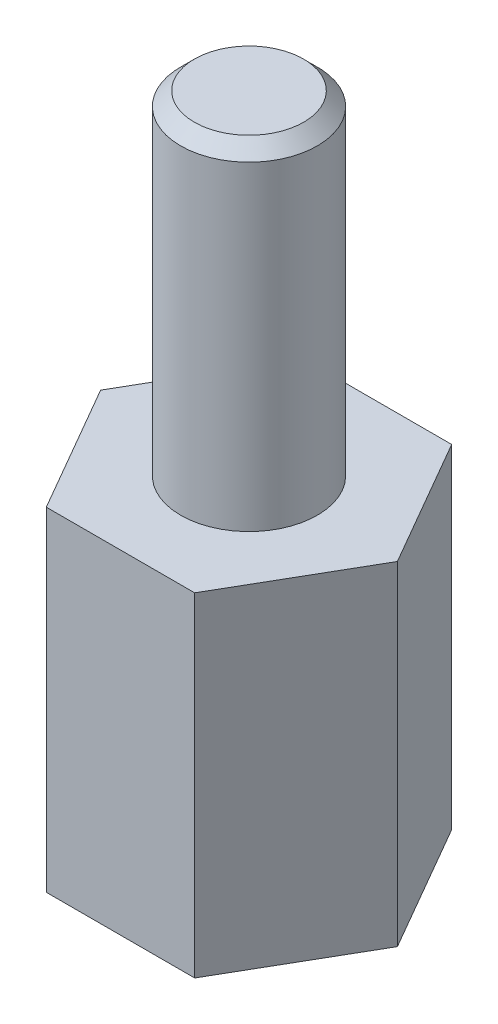
ISO-10303-21;
HEADER;
FILE_DESCRIPTION(('STEP AP214'),'2;1');
FILE_NAME('part.step','',(''),(''),'','','');
FILE_SCHEMA(('AUTOMOTIVE_DESIGN { 1 0 10303 214 1 1 1 1 }'));
ENDSEC;
DATA;
#1=APPLICATION_CONTEXT('core data for automotive mechanical design processes');
#2=APPLICATION_PROTOCOL_DEFINITION('international standard','automotive_design',2000,#1);
#3=PRODUCT_CONTEXT('',#1,'mechanical');
#4=PRODUCT('Part','Part','',(#3));
#5=PRODUCT_RELATED_PRODUCT_CATEGORY('part','',(#4));
#6=PRODUCT_DEFINITION_FORMATION('','',#4);
#7=PRODUCT_DEFINITION_CONTEXT('part definition',#1,'design');
#8=PRODUCT_DEFINITION('design','',#6,#7);
#9=PRODUCT_DEFINITION_SHAPE('','',#8);
#10=(LENGTH_UNIT() NAMED_UNIT(*) SI_UNIT(.MILLI.,.METRE.));
#11=(NAMED_UNIT(*) PLANE_ANGLE_UNIT() SI_UNIT($,.RADIAN.));
#12=(NAMED_UNIT(*) SI_UNIT($,.STERADIAN.) SOLID_ANGLE_UNIT());
#13=UNCERTAINTY_MEASURE_WITH_UNIT(LENGTH_MEASURE(1.E-05),#10,'distance_accuracy_value','');
#14=(GEOMETRIC_REPRESENTATION_CONTEXT(3) GLOBAL_UNCERTAINTY_ASSIGNED_CONTEXT((#13)) GLOBAL_UNIT_ASSIGNED_CONTEXT((#10,
#11,#12)) REPRESENTATION_CONTEXT('',''));
#15=CARTESIAN_POINT('',(0.,0.,0.));
#16=DIRECTION('',(0.,0.,1.));
#17=DIRECTION('',(1.,0.,0.));
#18=AXIS2_PLACEMENT_3D('',#15,#16,#17);
#19=CARTESIAN_POINT('',(1.35677313259562,6.1,2.35));
#20=DIRECTION('',(-0.866025403784439,0.,-0.5));
#21=DIRECTION('',(-0.5,0.,0.866025403784439));
#22=AXIS2_PLACEMENT_3D('',#19,#20,#21);
#23=PLANE('',#22);
#24=DIRECTION('',(0.5,0.,-0.866025403784439));
#25=VECTOR('',#24,1.);
#26=CARTESIAN_POINT('',(1.35677313259562,0.,2.35));
#27=LINE('',#26,#25);
#28=CARTESIAN_POINT('',(1.35677313259562,0.,2.35));
#29=VERTEX_POINT('',#28);
#30=CARTESIAN_POINT('',(2.71354626519124,0.,0.));
#31=VERTEX_POINT('',#30);
#32=EDGE_CURVE('E128',#29,#31,#27,.T.);
#33=ORIENTED_EDGE('',*,*,#32,.T.);
#34=DIRECTION('',(0.,-1.,0.));
#35=VECTOR('',#34,1.);
#36=CARTESIAN_POINT('',(2.71354626519124,6.1,0.));
#37=LINE('',#36,#35);
#38=CARTESIAN_POINT('',(2.71354626519124,6.1,0.));
#39=VERTEX_POINT('',#38);
#40=EDGE_CURVE('E146',#39,#31,#37,.T.);
#41=ORIENTED_EDGE('',*,*,#40,.F.);
#42=DIRECTION('',(0.5,0.,-0.866025403784439));
#43=VECTOR('',#42,1.);
#44=CARTESIAN_POINT('',(1.35677313259562,6.1,2.35));
#45=LINE('',#44,#43);
#46=CARTESIAN_POINT('',(1.35677313259562,6.1,2.35));
#47=VERTEX_POINT('',#46);
#48=EDGE_CURVE('E139',#47,#39,#45,.T.);
#49=ORIENTED_EDGE('',*,*,#48,.F.);
#50=DIRECTION('',(0.,-1.,0.));
#51=VECTOR('',#50,1.);
#52=CARTESIAN_POINT('',(1.35677313259562,6.1,2.35));
#53=LINE('',#52,#51);
#54=EDGE_CURVE('E124',#47,#29,#53,.T.);
#55=ORIENTED_EDGE('',*,*,#54,.T.);
#56=EDGE_LOOP('',(#33,#41,#49,#55));
#57=FACE_BOUND('',#56,.T.);
#58=ADVANCED_FACE('F41',(#57),#23,.F.);
#59=CARTESIAN_POINT('',(2.71354626519124,6.1,0.));
#60=DIRECTION('',(-0.866025403784438,0.,0.5));
#61=DIRECTION('',(0.5,0.,0.866025403784439));
#62=AXIS2_PLACEMENT_3D('',#59,#60,#61);
#63=PLANE('',#62);
#64=DIRECTION('',(-0.5,0.,-0.866025403784438));
#65=VECTOR('',#64,1.);
#66=CARTESIAN_POINT('',(2.71354626519124,0.,0.));
#67=LINE('',#66,#65);
#68=CARTESIAN_POINT('',(1.35677313259562,0.,-2.35));
#69=VERTEX_POINT('',#68);
#70=EDGE_CURVE('E131',#31,#69,#67,.T.);
#71=ORIENTED_EDGE('',*,*,#70,.T.);
#72=DIRECTION('',(0.,-1.,0.));
#73=VECTOR('',#72,1.);
#74=CARTESIAN_POINT('',(1.35677313259562,6.1,-2.35));
#75=LINE('',#74,#73);
#76=CARTESIAN_POINT('',(1.35677313259562,6.1,-2.35));
#77=VERTEX_POINT('',#76);
#78=EDGE_CURVE('E143',#77,#69,#75,.T.);
#79=ORIENTED_EDGE('',*,*,#78,.F.);
#80=DIRECTION('',(-0.5,0.,-0.866025403784438));
#81=VECTOR('',#80,1.);
#82=CARTESIAN_POINT('',(2.71354626519124,6.1,0.));
#83=LINE('',#82,#81);
#84=EDGE_CURVE('E97',#39,#77,#83,.T.);
#85=ORIENTED_EDGE('',*,*,#84,.F.);
#86=ORIENTED_EDGE('',*,*,#40,.T.);
#87=EDGE_LOOP('',(#71,#79,#85,#86));
#88=FACE_BOUND('',#87,.T.);
#89=ADVANCED_FACE('F162',(#88),#63,.F.);
#90=CARTESIAN_POINT('',(1.35677313259562,6.1,-2.35));
#91=DIRECTION('',(0.,0.,1.));
#92=DIRECTION('',(1.,0.,0.));
#93=AXIS2_PLACEMENT_3D('',#90,#91,#92);
#94=PLANE('',#93);
#95=DIRECTION('',(-1.,0.,0.));
#96=VECTOR('',#95,1.);
#97=CARTESIAN_POINT('',(1.35677313259562,0.,-2.35));
#98=LINE('',#97,#96);
#99=CARTESIAN_POINT('',(-1.35677313259562,0.,-2.35));
#100=VERTEX_POINT('',#99);
#101=EDGE_CURVE('E134',#69,#100,#98,.T.);
#102=ORIENTED_EDGE('',*,*,#101,.T.);
#103=DIRECTION('',(0.,-1.,0.));
#104=VECTOR('',#103,1.);
#105=CARTESIAN_POINT('',(-1.35677313259562,6.1,-2.35));
#106=LINE('',#105,#104);
#107=CARTESIAN_POINT('',(-1.35677313259562,6.1,-2.35));
#108=VERTEX_POINT('',#107);
#109=EDGE_CURVE('E119',#108,#100,#106,.T.);
#110=ORIENTED_EDGE('',*,*,#109,.F.);
#111=DIRECTION('',(-1.,0.,0.));
#112=VECTOR('',#111,1.);
#113=CARTESIAN_POINT('',(1.35677313259562,6.1,-2.35));
#114=LINE('',#113,#112);
#115=EDGE_CURVE('E110',#77,#108,#114,.T.);
#116=ORIENTED_EDGE('',*,*,#115,.F.);
#117=ORIENTED_EDGE('',*,*,#78,.T.);
#118=EDGE_LOOP('',(#102,#110,#116,#117));
#119=FACE_BOUND('',#118,.T.);
#120=ADVANCED_FACE('F165',(#119),#94,.F.);
#121=CARTESIAN_POINT('',(-1.35677313259562,6.1,-2.35));
#122=DIRECTION('',(0.866025403784439,0.,0.5));
#123=DIRECTION('',(0.5,0.,-0.866025403784439));
#124=AXIS2_PLACEMENT_3D('',#121,#122,#123);
#125=PLANE('',#124);
#126=DIRECTION('',(-0.5,0.,0.866025403784439));
#127=VECTOR('',#126,1.);
#128=CARTESIAN_POINT('',(-1.35677313259562,0.,-2.35));
#129=LINE('',#128,#127);
#130=CARTESIAN_POINT('',(-2.71354626519124,0.,0.));
#131=VERTEX_POINT('',#130);
#132=EDGE_CURVE('E118',#100,#131,#129,.T.);
#133=ORIENTED_EDGE('',*,*,#132,.T.);
#134=DIRECTION('',(0.,-1.,0.));
#135=VECTOR('',#134,1.);
#136=CARTESIAN_POINT('',(-2.71354626519124,6.1,0.));
#137=LINE('',#136,#135);
#138=CARTESIAN_POINT('',(-2.71354626519124,6.1,0.));
#139=VERTEX_POINT('',#138);
#140=EDGE_CURVE('E115',#139,#131,#137,.T.);
#141=ORIENTED_EDGE('',*,*,#140,.F.);
#142=DIRECTION('',(-0.5,0.,0.866025403784439));
#143=VECTOR('',#142,1.);
#144=CARTESIAN_POINT('',(-1.35677313259562,6.1,-2.35));
#145=LINE('',#144,#143);
#146=EDGE_CURVE('E104',#108,#139,#145,.T.);
#147=ORIENTED_EDGE('',*,*,#146,.F.);
#148=ORIENTED_EDGE('',*,*,#109,.T.);
#149=EDGE_LOOP('',(#133,#141,#147,#148));
#150=FACE_BOUND('',#149,.T.);
#151=ADVANCED_FACE('F116',(#150),#125,.F.);
#152=CARTESIAN_POINT('',(-2.71354626519124,6.1,0.));
#153=DIRECTION('',(0.866025403784438,0.,-0.5));
#154=DIRECTION('',(-0.5,0.,-0.866025403784439));
#155=AXIS2_PLACEMENT_3D('',#152,#153,#154);
#156=PLANE('',#155);
#157=DIRECTION('',(0.5,0.,0.866025403784438));
#158=VECTOR('',#157,1.);
#159=CARTESIAN_POINT('',(-2.71354626519124,0.,0.));
#160=LINE('',#159,#158);
#161=CARTESIAN_POINT('',(-1.35677313259562,0.,2.35));
#162=VERTEX_POINT('',#161);
#163=EDGE_CURVE('E82',#131,#162,#160,.T.);
#164=ORIENTED_EDGE('',*,*,#163,.T.);
#165=DIRECTION('',(0.,-1.,0.));
#166=VECTOR('',#165,1.);
#167=CARTESIAN_POINT('',(-1.35677313259562,6.1,2.35));
#168=LINE('',#167,#166);
#169=CARTESIAN_POINT('',(-1.35677313259562,6.1,2.35));
#170=VERTEX_POINT('',#169);
#171=EDGE_CURVE('E120',#170,#162,#168,.T.);
#172=ORIENTED_EDGE('',*,*,#171,.F.);
#173=DIRECTION('',(0.5,0.,0.866025403784438));
#174=VECTOR('',#173,1.);
#175=CARTESIAN_POINT('',(-2.71354626519124,6.1,0.));
#176=LINE('',#175,#174);
#177=EDGE_CURVE('E108',#139,#170,#176,.T.);
#178=ORIENTED_EDGE('',*,*,#177,.F.);
#179=ORIENTED_EDGE('',*,*,#140,.T.);
#180=EDGE_LOOP('',(#164,#172,#178,#179));
#181=FACE_BOUND('',#180,.T.);
#182=ADVANCED_FACE('F122',(#181),#156,.F.);
#183=CARTESIAN_POINT('',(-1.35677313259562,6.1,2.35));
#184=DIRECTION('',(0.,0.,-1.));
#185=DIRECTION('',(-1.,0.,0.));
#186=AXIS2_PLACEMENT_3D('',#183,#184,#185);
#187=PLANE('',#186);
#188=DIRECTION('',(1.,0.,0.));
#189=VECTOR('',#188,1.);
#190=CARTESIAN_POINT('',(-1.35677313259562,0.,2.35));
#191=LINE('',#190,#189);
#192=EDGE_CURVE('E88',#162,#29,#191,.T.);
#193=ORIENTED_EDGE('',*,*,#192,.T.);
#194=ORIENTED_EDGE('',*,*,#54,.F.);
#195=DIRECTION('',(1.,0.,0.));
#196=VECTOR('',#195,1.);
#197=CARTESIAN_POINT('',(-1.35677313259562,6.1,2.35));
#198=LINE('',#197,#196);
#199=EDGE_CURVE('E59',#170,#47,#198,.T.);
#200=ORIENTED_EDGE('',*,*,#199,.F.);
#201=ORIENTED_EDGE('',*,*,#171,.T.);
#202=EDGE_LOOP('',(#193,#194,#200,#201));
#203=FACE_BOUND('',#202,.T.);
#204=ADVANCED_FACE('F170',(#203),#187,.F.);
#205=CARTESIAN_POINT('',(0.,6.1,0.));
#206=DIRECTION('',(0.,1.,0.));
#207=DIRECTION('',(0.,0.,1.));
#208=AXIS2_PLACEMENT_3D('',#205,#206,#207);
#209=PLANE('',#208);
#210=CARTESIAN_POINT('',(0.,6.1,0.));
#211=DIRECTION('',(0.,1.,0.));
#212=DIRECTION('',(0.,0.,1.));
#213=AXIS2_PLACEMENT_3D('',#210,#211,#212);
#214=CIRCLE('',#213,1.25);
#215=CARTESIAN_POINT('',(0.,6.1,1.25));
#216=VERTEX_POINT('',#215);
#217=EDGE_CURVE('E147',#216,#216,#214,.T.);
#218=ORIENTED_EDGE('',*,*,#217,.F.);
#219=EDGE_LOOP('',(#218));
#220=FACE_BOUND('',#219,.T.);
#221=ORIENTED_EDGE('',*,*,#48,.T.);
#222=ORIENTED_EDGE('',*,*,#84,.T.);
#223=ORIENTED_EDGE('',*,*,#115,.T.);
#224=ORIENTED_EDGE('',*,*,#146,.T.);
#225=ORIENTED_EDGE('',*,*,#177,.T.);
#226=ORIENTED_EDGE('',*,*,#199,.T.);
#227=EDGE_LOOP('',(#221,#222,#223,#224,#225,#226));
#228=FACE_BOUND('',#227,.T.);
#229=ADVANCED_FACE('F106',(#220,#228),#209,.T.);
#230=CARTESIAN_POINT('',(0.,0.,0.));
#231=DIRECTION('',(0.,1.,0.));
#232=DIRECTION('',(0.,0.,1.));
#233=AXIS2_PLACEMENT_3D('',#230,#231,#232);
#234=PLANE('',#233);
#235=CARTESIAN_POINT('',(0.,0.,0.));
#236=DIRECTION('',(0.,-1.,0.));
#237=DIRECTION('',(0.,0.,-1.));
#238=AXIS2_PLACEMENT_3D('',#235,#236,#237);
#239=CIRCLE('',#238,1.25);
#240=CARTESIAN_POINT('',(0.,0.,-1.25));
#241=VERTEX_POINT('',#240);
#242=EDGE_CURVE('E157',#241,#241,#239,.T.);
#243=ORIENTED_EDGE('',*,*,#242,.F.);
#244=EDGE_LOOP('',(#243));
#245=FACE_BOUND('',#244,.T.);
#246=ORIENTED_EDGE('',*,*,#32,.F.);
#247=ORIENTED_EDGE('',*,*,#192,.F.);
#248=ORIENTED_EDGE('',*,*,#163,.F.);
#249=ORIENTED_EDGE('',*,*,#132,.F.);
#250=ORIENTED_EDGE('',*,*,#101,.F.);
#251=ORIENTED_EDGE('',*,*,#70,.F.);
#252=EDGE_LOOP('',(#246,#247,#248,#249,#250,#251));
#253=FACE_BOUND('',#252,.T.);
#254=ADVANCED_FACE('F168',(#245,#253),#234,.F.);
#255=CARTESIAN_POINT('',(0.,12.2,0.));
#256=DIRECTION('',(0.,-1.,0.));
#257=DIRECTION('',(0.,0.,-1.));
#258=AXIS2_PLACEMENT_3D('',#255,#256,#257);
#259=CYLINDRICAL_SURFACE('',#258,1.25);
#260=CARTESIAN_POINT('',(0.,11.95,0.));
#261=DIRECTION('',(0.,1.,0.));
#262=DIRECTION('',(0.,0.,1.));
#263=AXIS2_PLACEMENT_3D('',#260,#261,#262);
#264=CIRCLE('',#263,1.25);
#265=CARTESIAN_POINT('',(0.,11.95,1.25));
#266=VERTEX_POINT('',#265);
#267=EDGE_CURVE('E11',#266,#266,#264,.F.);
#268=ORIENTED_EDGE('',*,*,#267,.T.);
#269=EDGE_LOOP('',(#268));
#270=FACE_BOUND('',#269,.T.);
#271=ORIENTED_EDGE('',*,*,#217,.T.);
#272=EDGE_LOOP('',(#271));
#273=FACE_BOUND('',#272,.T.);
#274=ADVANCED_FACE('F220',(#270,#273),#259,.T.);
#275=CARTESIAN_POINT('',(0.,12.2,0.));
#276=DIRECTION('',(0.,1.,0.));
#277=DIRECTION('',(0.,0.,1.));
#278=AXIS2_PLACEMENT_3D('',#275,#276,#277);
#279=PLANE('',#278);
#280=CARTESIAN_POINT('',(0.,12.2,0.));
#281=DIRECTION('',(0.,1.,0.));
#282=DIRECTION('',(0.,0.,1.));
#283=AXIS2_PLACEMENT_3D('',#280,#281,#282);
#284=CIRCLE('',#283,1.);
#285=CARTESIAN_POINT('',(0.,12.2,1.));
#286=VERTEX_POINT('',#285);
#287=EDGE_CURVE('E51',#286,#286,#284,.T.);
#288=ORIENTED_EDGE('',*,*,#287,.T.);
#289=EDGE_LOOP('',(#288));
#290=FACE_BOUND('',#289,.T.);
#291=ADVANCED_FACE('F230',(#290),#279,.T.);
#292=CARTESIAN_POINT('',(0.,12.2,0.));
#293=DIRECTION('',(0.,-1.,0.));
#294=DIRECTION('',(0.,0.,-1.));
#295=AXIS2_PLACEMENT_3D('',#292,#293,#294);
#296=CONICAL_SURFACE('',#295,1.,0.785398163397443);
#297=ORIENTED_EDGE('',*,*,#267,.F.);
#298=EDGE_LOOP('',(#297));
#299=FACE_BOUND('',#298,.T.);
#300=ORIENTED_EDGE('',*,*,#287,.F.);
#301=EDGE_LOOP('',(#300));
#302=FACE_BOUND('',#301,.T.);
#303=ADVANCED_FACE('F44',(#299,#302),#296,.T.);
#304=CARTESIAN_POINT('',(0.,5.5,0.));
#305=DIRECTION('',(0.,-1.,0.));
#306=DIRECTION('',(0.,0.,-1.));
#307=AXIS2_PLACEMENT_3D('',#304,#305,#306);
#308=CYLINDRICAL_SURFACE('',#307,1.25);
#309=CARTESIAN_POINT('',(0.,5.5,0.));
#310=DIRECTION('',(0.,-1.,0.));
#311=DIRECTION('',(0.,0.,-1.));
#312=AXIS2_PLACEMENT_3D('',#309,#310,#311);
#313=CIRCLE('',#312,1.25);
#314=CARTESIAN_POINT('',(0.,5.5,-1.25));
#315=VERTEX_POINT('',#314);
#316=EDGE_CURVE('E132',#315,#315,#313,.T.);
#317=ORIENTED_EDGE('',*,*,#316,.F.);
#318=EDGE_LOOP('',(#317));
#319=FACE_BOUND('',#318,.T.);
#320=ORIENTED_EDGE('',*,*,#242,.T.);
#321=EDGE_LOOP('',(#320));
#322=FACE_BOUND('',#321,.T.);
#323=ADVANCED_FACE('F247',(#319,#322),#308,.F.);
#324=CARTESIAN_POINT('',(0.,5.5,0.));
#325=DIRECTION('',(0.,-1.,0.));
#326=DIRECTION('',(0.,0.,-1.));
#327=AXIS2_PLACEMENT_3D('',#324,#325,#326);
#328=PLANE('',#327);
#329=ORIENTED_EDGE('',*,*,#316,.T.);
#330=EDGE_LOOP('',(#329));
#331=FACE_BOUND('',#330,.T.);
#332=ADVANCED_FACE('F255',(#331),#328,.T.);
#333=CLOSED_SHELL('',(#58,#89,#120,#151,#182,#204,#229,#254,#274,#291,#303,#323,#332));
#334=MANIFOLD_SOLID_BREP('B2',#333);
#335=ADVANCED_BREP_SHAPE_REPRESENTATION('',(#18,#334),#14);
#336=SHAPE_DEFINITION_REPRESENTATION(#9,#335);
ENDSEC;
END-ISO-10303-21;
